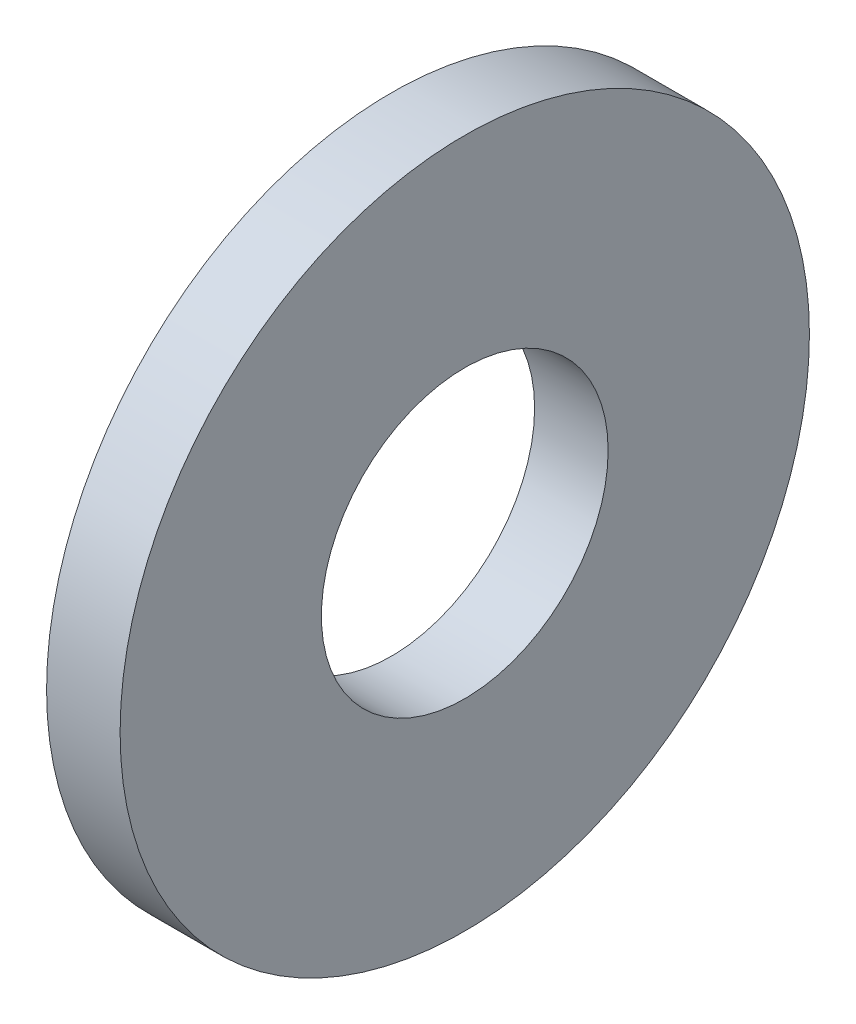
ISO-10303-21;
HEADER;
FILE_DESCRIPTION(('STEP AP214'),'2;1');
FILE_NAME('part.step','',(''),(''),'','','');
FILE_SCHEMA(('AUTOMOTIVE_DESIGN { 1 0 10303 214 1 1 1 1 }'));
ENDSEC;
DATA;
#1=APPLICATION_CONTEXT('core data for automotive mechanical design processes');
#2=APPLICATION_PROTOCOL_DEFINITION('international standard','automotive_design',2000,#1);
#3=PRODUCT_CONTEXT('',#1,'mechanical');
#4=PRODUCT('Part','Part','',(#3));
#5=PRODUCT_RELATED_PRODUCT_CATEGORY('part','',(#4));
#6=PRODUCT_DEFINITION_FORMATION('','',#4);
#7=PRODUCT_DEFINITION_CONTEXT('part definition',#1,'design');
#8=PRODUCT_DEFINITION('design','',#6,#7);
#9=PRODUCT_DEFINITION_SHAPE('','',#8);
#10=(LENGTH_UNIT() NAMED_UNIT(*) SI_UNIT(.MILLI.,.METRE.));
#11=(NAMED_UNIT(*) PLANE_ANGLE_UNIT() SI_UNIT($,.RADIAN.));
#12=(NAMED_UNIT(*) SI_UNIT($,.STERADIAN.) SOLID_ANGLE_UNIT());
#13=UNCERTAINTY_MEASURE_WITH_UNIT(LENGTH_MEASURE(1.E-05),#10,'distance_accuracy_value','');
#14=(GEOMETRIC_REPRESENTATION_CONTEXT(3) GLOBAL_UNCERTAINTY_ASSIGNED_CONTEXT((#13)) GLOBAL_UNIT_ASSIGNED_CONTEXT((#10,
#11,#12)) REPRESENTATION_CONTEXT('',''));
#15=CARTESIAN_POINT('',(0.,0.,0.));
#16=DIRECTION('',(0.,0.,1.));
#17=DIRECTION('',(1.,0.,0.));
#18=AXIS2_PLACEMENT_3D('',#15,#16,#17);
#19=CARTESIAN_POINT('',(2.032,0.,0.));
#20=DIRECTION('',(1.,0.,0.));
#21=DIRECTION('',(0.,0.,-1.));
#22=AXIS2_PLACEMENT_3D('',#19,#20,#21);
#23=PLANE('',#22);
#24=CARTESIAN_POINT('',(2.032,0.,0.));
#25=DIRECTION('',(1.,0.,0.));
#26=DIRECTION('',(0.,0.,-1.));
#27=AXIS2_PLACEMENT_3D('',#24,#25,#26);
#28=CIRCLE('',#27,9.525);
#29=CARTESIAN_POINT('',(2.032,0.,-9.525));
#30=VERTEX_POINT('',#29);
#31=EDGE_CURVE('E10',#30,#30,#28,.T.);
#32=ORIENTED_EDGE('',*,*,#31,.T.);
#33=EDGE_LOOP('',(#32));
#34=FACE_BOUND('',#33,.T.);
#35=CARTESIAN_POINT('',(2.032,0.,0.));
#36=DIRECTION('',(1.,0.,0.));
#37=DIRECTION('',(0.,0.,-1.));
#38=AXIS2_PLACEMENT_3D('',#35,#36,#37);
#39=CIRCLE('',#38,3.9624);
#40=CARTESIAN_POINT('',(2.032,0.,-3.9624));
#41=VERTEX_POINT('',#40);
#42=EDGE_CURVE('E46',#41,#41,#39,.T.);
#43=ORIENTED_EDGE('',*,*,#42,.F.);
#44=EDGE_LOOP('',(#43));
#45=FACE_BOUND('',#44,.T.);
#46=ADVANCED_FACE('F35',(#34,#45),#23,.T.);
#47=CARTESIAN_POINT('',(0.,0.,0.));
#48=DIRECTION('',(1.,0.,0.));
#49=DIRECTION('',(0.,0.,-1.));
#50=AXIS2_PLACEMENT_3D('',#47,#48,#49);
#51=PLANE('',#50);
#52=CARTESIAN_POINT('',(0.,0.,0.));
#53=DIRECTION('',(1.,0.,0.));
#54=DIRECTION('',(0.,0.,-1.));
#55=AXIS2_PLACEMENT_3D('',#52,#53,#54);
#56=CIRCLE('',#55,9.525);
#57=CARTESIAN_POINT('',(0.,0.,-9.525));
#58=VERTEX_POINT('',#57);
#59=EDGE_CURVE('E39',#58,#58,#56,.T.);
#60=ORIENTED_EDGE('',*,*,#59,.F.);
#61=EDGE_LOOP('',(#60));
#62=FACE_BOUND('',#61,.T.);
#63=CARTESIAN_POINT('',(0.,0.,0.));
#64=DIRECTION('',(1.,0.,0.));
#65=DIRECTION('',(0.,0.,-1.));
#66=AXIS2_PLACEMENT_3D('',#63,#64,#65);
#67=CIRCLE('',#66,3.9624);
#68=CARTESIAN_POINT('',(0.,0.,-3.9624));
#69=VERTEX_POINT('',#68);
#70=EDGE_CURVE('E48',#69,#69,#67,.T.);
#71=ORIENTED_EDGE('',*,*,#70,.T.);
#72=EDGE_LOOP('',(#71));
#73=FACE_BOUND('',#72,.T.);
#74=ADVANCED_FACE('F58',(#62,#73),#51,.F.);
#75=CARTESIAN_POINT('',(2.032,0.,0.));
#76=DIRECTION('',(-1.,0.,0.));
#77=DIRECTION('',(0.,0.,1.));
#78=AXIS2_PLACEMENT_3D('',#75,#76,#77);
#79=CYLINDRICAL_SURFACE('',#78,9.525);
#80=ORIENTED_EDGE('',*,*,#31,.F.);
#81=EDGE_LOOP('',(#80));
#82=FACE_BOUND('',#81,.T.);
#83=ORIENTED_EDGE('',*,*,#59,.T.);
#84=EDGE_LOOP('',(#83));
#85=FACE_BOUND('',#84,.T.);
#86=ADVANCED_FACE('F37',(#82,#85),#79,.T.);
#87=CARTESIAN_POINT('',(2.032,0.,0.));
#88=DIRECTION('',(-1.,0.,0.));
#89=DIRECTION('',(0.,0.,1.));
#90=AXIS2_PLACEMENT_3D('',#87,#88,#89);
#91=CYLINDRICAL_SURFACE('',#90,3.9624);
#92=ORIENTED_EDGE('',*,*,#42,.T.);
#93=EDGE_LOOP('',(#92));
#94=FACE_BOUND('',#93,.T.);
#95=ORIENTED_EDGE('',*,*,#70,.F.);
#96=EDGE_LOOP('',(#95));
#97=FACE_BOUND('',#96,.T.);
#98=ADVANCED_FACE('F54',(#94,#97),#91,.F.);
#99=CLOSED_SHELL('',(#46,#74,#86,#98));
#100=MANIFOLD_SOLID_BREP('B2',#99);
#101=ADVANCED_BREP_SHAPE_REPRESENTATION('',(#18,#100),#14);
#102=SHAPE_DEFINITION_REPRESENTATION(#9,#101);
ENDSEC;
END-ISO-10303-21;
